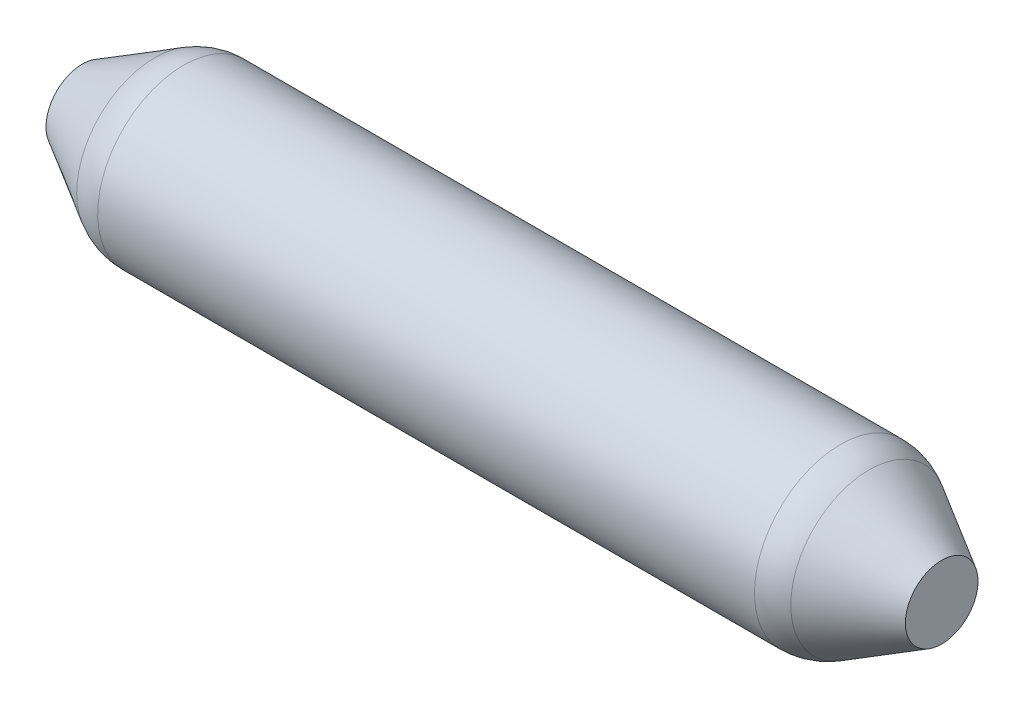
ISO-10303-21;
HEADER;
FILE_DESCRIPTION(('STEP AP214'),'2;1');
FILE_NAME('part.step','',(''),(''),'','','');
FILE_SCHEMA(('AUTOMOTIVE_DESIGN { 1 0 10303 214 1 1 1 1 }'));
ENDSEC;
DATA;
#1=APPLICATION_CONTEXT('core data for automotive mechanical design processes');
#2=APPLICATION_PROTOCOL_DEFINITION('international standard','automotive_design',2000,#1);
#3=PRODUCT_CONTEXT('',#1,'mechanical');
#4=PRODUCT('Part','Part','',(#3));
#5=PRODUCT_RELATED_PRODUCT_CATEGORY('part','',(#4));
#6=PRODUCT_DEFINITION_FORMATION('','',#4);
#7=PRODUCT_DEFINITION_CONTEXT('part definition',#1,'design');
#8=PRODUCT_DEFINITION('design','',#6,#7);
#9=PRODUCT_DEFINITION_SHAPE('','',#8);
#10=(LENGTH_UNIT() NAMED_UNIT(*) SI_UNIT(.MILLI.,.METRE.));
#11=(NAMED_UNIT(*) PLANE_ANGLE_UNIT() SI_UNIT($,.RADIAN.));
#12=(NAMED_UNIT(*) SI_UNIT($,.STERADIAN.) SOLID_ANGLE_UNIT());
#13=UNCERTAINTY_MEASURE_WITH_UNIT(LENGTH_MEASURE(1.E-05),#10,'distance_accuracy_value','');
#14=(GEOMETRIC_REPRESENTATION_CONTEXT(3) GLOBAL_UNCERTAINTY_ASSIGNED_CONTEXT((#13)) GLOBAL_UNIT_ASSIGNED_CONTEXT((#10,
#11,#12)) REPRESENTATION_CONTEXT('',''));
#15=CARTESIAN_POINT('',(0.,0.,0.));
#16=DIRECTION('',(0.,0.,1.));
#17=DIRECTION('',(1.,0.,0.));
#18=AXIS2_PLACEMENT_3D('',#15,#16,#17);
#19=CARTESIAN_POINT('',(30.,0.,0.));
#20=DIRECTION('',(-1.,0.,0.));
#21=DIRECTION('',(0.,-1.,0.));
#22=AXIS2_PLACEMENT_3D('',#19,#20,#21);
#23=PLANE('',#22);
#24=CARTESIAN_POINT('',(30.,0.,0.));
#25=DIRECTION('',(-1.,0.,0.));
#26=DIRECTION('',(0.,-1.,0.));
#27=AXIS2_PLACEMENT_3D('',#24,#25,#26);
#28=CIRCLE('',#27,1.26794919243113);
#29=CARTESIAN_POINT('',(30.,-1.26794919243113,0.));
#30=VERTEX_POINT('',#29);
#31=EDGE_CURVE('E51',#30,#30,#28,.T.);
#32=ORIENTED_EDGE('',*,*,#31,.F.);
#33=EDGE_LOOP('',(#32));
#34=FACE_BOUND('',#33,.T.);
#35=ADVANCED_FACE('F31',(#34),#23,.F.);
#36=CARTESIAN_POINT('',(30.,0.,0.));
#37=DIRECTION('',(-1.,0.,0.));
#38=DIRECTION('',(0.,-1.,0.));
#39=AXIS2_PLACEMENT_3D('',#36,#37,#38);
#40=CONICAL_SURFACE('',#39,1.26794919243113,0.523598775598297);
#41=CARTESIAN_POINT('',(27.4641016151377,0.,0.));
#42=DIRECTION('',(1.,0.,0.));
#43=DIRECTION('',(0.,1.,0.));
#44=AXIS2_PLACEMENT_3D('',#41,#42,#43);
#45=CIRCLE('',#44,2.73205080756888);
#46=CARTESIAN_POINT('',(27.4641016151377,2.73205080756888,0.));
#47=VERTEX_POINT('',#46);
#48=EDGE_CURVE('E10',#47,#47,#45,.T.);
#49=ORIENTED_EDGE('',*,*,#48,.T.);
#50=EDGE_LOOP('',(#49));
#51=FACE_BOUND('',#50,.T.);
#52=ORIENTED_EDGE('',*,*,#31,.T.);
#53=EDGE_LOOP('',(#52));
#54=FACE_BOUND('',#53,.T.);
#55=ADVANCED_FACE('F71',(#51,#54),#40,.T.);
#56=CARTESIAN_POINT('',(0.,0.,0.));
#57=DIRECTION('',(-1.,0.,0.));
#58=DIRECTION('',(0.,-1.,0.));
#59=AXIS2_PLACEMENT_3D('',#56,#57,#58);
#60=CYLINDRICAL_SURFACE('',#59,3.);
#61=CARTESIAN_POINT('',(3.53589838486224,0.,0.));
#62=DIRECTION('',(1.,0.,0.));
#63=DIRECTION('',(0.,1.,0.));
#64=AXIS2_PLACEMENT_3D('',#61,#62,#63);
#65=CIRCLE('',#64,3.);
#66=CARTESIAN_POINT('',(3.53589838486224,3.,0.));
#67=VERTEX_POINT('',#66);
#68=EDGE_CURVE('E38',#67,#67,#65,.T.);
#69=ORIENTED_EDGE('',*,*,#68,.T.);
#70=EDGE_LOOP('',(#69));
#71=FACE_BOUND('',#70,.T.);
#72=CARTESIAN_POINT('',(26.4641016151378,0.,0.));
#73=DIRECTION('',(1.,0.,0.));
#74=DIRECTION('',(0.,1.,0.));
#75=AXIS2_PLACEMENT_3D('',#72,#73,#74);
#76=CIRCLE('',#75,3.);
#77=CARTESIAN_POINT('',(26.4641016151378,3.,0.));
#78=VERTEX_POINT('',#77);
#79=EDGE_CURVE('E42',#78,#78,#76,.F.);
#80=ORIENTED_EDGE('',*,*,#79,.T.);
#81=EDGE_LOOP('',(#80));
#82=FACE_BOUND('',#81,.T.);
#83=ADVANCED_FACE('F62',(#71,#82),#60,.T.);
#84=CARTESIAN_POINT('',(3.,0.,0.));
#85=DIRECTION('',(1.,0.,0.));
#86=DIRECTION('',(0.,1.,0.));
#87=AXIS2_PLACEMENT_3D('',#84,#85,#86);
#88=CONICAL_SURFACE('',#87,3.,0.523598775598296);
#89=CARTESIAN_POINT('',(2.53589838486225,0.,0.));
#90=DIRECTION('',(-1.,0.,0.));
#91=DIRECTION('',(0.,-1.,0.));
#92=AXIS2_PLACEMENT_3D('',#89,#90,#91);
#93=CIRCLE('',#92,2.73205080756888);
#94=CARTESIAN_POINT('',(2.53589838486225,-2.73205080756888,0.));
#95=VERTEX_POINT('',#94);
#96=EDGE_CURVE('E46',#95,#95,#93,.T.);
#97=ORIENTED_EDGE('',*,*,#96,.T.);
#98=EDGE_LOOP('',(#97));
#99=FACE_BOUND('',#98,.T.);
#100=CARTESIAN_POINT('',(0.,0.,0.));
#101=DIRECTION('',(-1.,0.,0.));
#102=DIRECTION('',(0.,-1.,0.));
#103=AXIS2_PLACEMENT_3D('',#100,#101,#102);
#104=CIRCLE('',#103,1.26794919243113);
#105=CARTESIAN_POINT('',(0.,-1.26794919243113,0.));
#106=VERTEX_POINT('',#105);
#107=EDGE_CURVE('E54',#106,#106,#104,.T.);
#108=ORIENTED_EDGE('',*,*,#107,.F.);
#109=EDGE_LOOP('',(#108));
#110=FACE_BOUND('',#109,.T.);
#111=ADVANCED_FACE('F60',(#99,#110),#88,.T.);
#112=CARTESIAN_POINT('',(0.,0.,0.));
#113=DIRECTION('',(1.,0.,0.));
#114=DIRECTION('',(0.,1.,0.));
#115=AXIS2_PLACEMENT_3D('',#112,#113,#114);
#116=PLANE('',#115);
#117=ORIENTED_EDGE('',*,*,#107,.T.);
#118=EDGE_LOOP('',(#117));
#119=FACE_BOUND('',#118,.T.);
#120=ADVANCED_FACE('F58',(#119),#116,.F.);
#121=CARTESIAN_POINT('',(3.53589838486224,0.,0.));
#122=DIRECTION('',(1.,0.,0.));
#123=DIRECTION('',(0.,1.,0.));
#124=AXIS2_PLACEMENT_3D('',#121,#122,#123);
#125=DEGENERATE_TOROIDAL_SURFACE('',#124,1.,2.,.T.);
#126=ORIENTED_EDGE('',*,*,#68,.F.);
#127=EDGE_LOOP('',(#126));
#128=FACE_BOUND('',#127,.T.);
#129=ORIENTED_EDGE('',*,*,#96,.F.);
#130=EDGE_LOOP('',(#129));
#131=FACE_BOUND('',#130,.T.);
#132=ADVANCED_FACE('F69',(#128,#131),#125,.T.);
#133=CARTESIAN_POINT('',(26.4641016151378,0.,0.));
#134=DIRECTION('',(1.,0.,0.));
#135=DIRECTION('',(0.,1.,0.));
#136=AXIS2_PLACEMENT_3D('',#133,#134,#135);
#137=DEGENERATE_TOROIDAL_SURFACE('',#136,0.999999999999999,2.,.T.);
#138=ORIENTED_EDGE('',*,*,#48,.F.);
#139=EDGE_LOOP('',(#138));
#140=FACE_BOUND('',#139,.T.);
#141=ORIENTED_EDGE('',*,*,#79,.F.);
#142=EDGE_LOOP('',(#141));
#143=FACE_BOUND('',#142,.T.);
#144=ADVANCED_FACE('F33',(#140,#143),#137,.T.);
#145=CLOSED_SHELL('',(#35,#55,#83,#111,#120,#132,#144));
#146=MANIFOLD_SOLID_BREP('B2',#145);
#147=ADVANCED_BREP_SHAPE_REPRESENTATION('',(#18,#146),#14);
#148=SHAPE_DEFINITION_REPRESENTATION(#9,#147);
ENDSEC;
END-ISO-10303-21;
